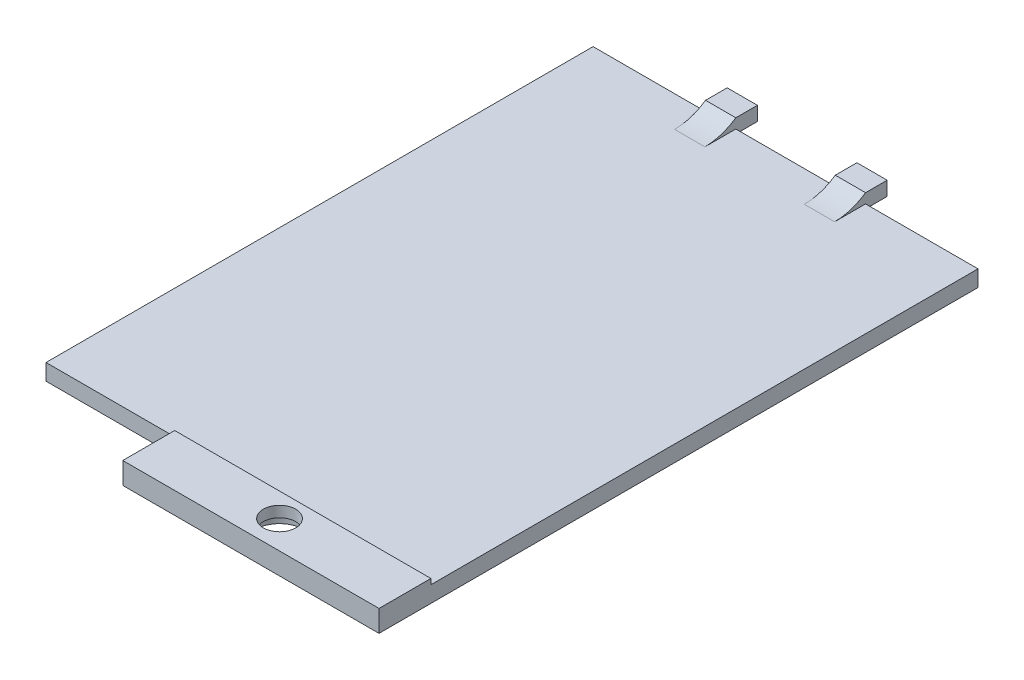
ISO-10303-21;
HEADER;
FILE_DESCRIPTION(('STEP AP214'),'2;1');
FILE_NAME('part.step','',(''),(''),'','','');
FILE_SCHEMA(('AUTOMOTIVE_DESIGN { 1 0 10303 214 1 1 1 1 }'));
ENDSEC;
DATA;
#1=APPLICATION_CONTEXT('core data for automotive mechanical design processes');
#2=APPLICATION_PROTOCOL_DEFINITION('international standard','automotive_design',2000,#1);
#3=PRODUCT_CONTEXT('',#1,'mechanical');
#4=PRODUCT('Part','Part','',(#3));
#5=PRODUCT_RELATED_PRODUCT_CATEGORY('part','',(#4));
#6=PRODUCT_DEFINITION_FORMATION('','',#4);
#7=PRODUCT_DEFINITION_CONTEXT('part definition',#1,'design');
#8=PRODUCT_DEFINITION('design','',#6,#7);
#9=PRODUCT_DEFINITION_SHAPE('','',#8);
#10=(LENGTH_UNIT() NAMED_UNIT(*) SI_UNIT(.MILLI.,.METRE.));
#11=(NAMED_UNIT(*) PLANE_ANGLE_UNIT() SI_UNIT($,.RADIAN.));
#12=(NAMED_UNIT(*) SI_UNIT($,.STERADIAN.) SOLID_ANGLE_UNIT());
#13=UNCERTAINTY_MEASURE_WITH_UNIT(LENGTH_MEASURE(1.E-05),#10,'distance_accuracy_value','');
#14=(GEOMETRIC_REPRESENTATION_CONTEXT(3) GLOBAL_UNCERTAINTY_ASSIGNED_CONTEXT((#13)) GLOBAL_UNIT_ASSIGNED_CONTEXT((#10,
#11,#12)) REPRESENTATION_CONTEXT('',''));
#15=CARTESIAN_POINT('',(0.,0.,0.));
#16=DIRECTION('',(0.,0.,1.));
#17=DIRECTION('',(1.,0.,0.));
#18=AXIS2_PLACEMENT_3D('',#15,#16,#17);
#19=CARTESIAN_POINT('',(0.,1.5,0.));
#20=DIRECTION('',(0.,0.,1.));
#21=DIRECTION('',(1.,0.,0.));
#22=AXIS2_PLACEMENT_3D('',#19,#20,#21);
#23=PLANE('',#22);
#24=DIRECTION('',(0.,1.,0.));
#25=VECTOR('',#24,1.);
#26=CARTESIAN_POINT('',(10.4,1.1,0.));
#27=LINE('',#26,#25);
#28=CARTESIAN_POINT('',(10.4,1.1,0.));
#29=VERTEX_POINT('',#28);
#30=CARTESIAN_POINT('',(10.4,1.5,0.));
#31=VERTEX_POINT('',#30);
#32=EDGE_CURVE('E207',#29,#31,#27,.T.);
#33=ORIENTED_EDGE('',*,*,#32,.F.);
#34=DIRECTION('',(-1.,0.,0.));
#35=VECTOR('',#34,1.);
#36=CARTESIAN_POINT('',(13.2,1.1,0.));
#37=LINE('',#36,#35);
#38=CARTESIAN_POINT('',(13.2,1.1,0.));
#39=VERTEX_POINT('',#38);
#40=EDGE_CURVE('E189',#39,#29,#37,.T.);
#41=ORIENTED_EDGE('',*,*,#40,.F.);
#42=DIRECTION('',(0.,1.,0.));
#43=VECTOR('',#42,1.);
#44=CARTESIAN_POINT('',(13.2,1.1,0.));
#45=LINE('',#44,#43);
#46=CARTESIAN_POINT('',(13.2,1.5,0.));
#47=VERTEX_POINT('',#46);
#48=EDGE_CURVE('E199',#39,#47,#45,.T.);
#49=ORIENTED_EDGE('',*,*,#48,.T.);
#50=DIRECTION('',(-1.,0.,0.));
#51=VECTOR('',#50,1.);
#52=CARTESIAN_POINT('',(0.,1.5,0.));
#53=LINE('',#52,#51);
#54=CARTESIAN_POINT('',(22.4,1.5,0.));
#55=VERTEX_POINT('',#54);
#56=EDGE_CURVE('E300',#55,#47,#53,.T.);
#57=ORIENTED_EDGE('',*,*,#56,.F.);
#58=DIRECTION('',(0.,1.,0.));
#59=VECTOR('',#58,1.);
#60=CARTESIAN_POINT('',(22.4,1.1,0.));
#61=LINE('',#60,#59);
#62=CARTESIAN_POINT('',(22.4,1.1,0.));
#63=VERTEX_POINT('',#62);
#64=EDGE_CURVE('E211',#63,#55,#61,.T.);
#65=ORIENTED_EDGE('',*,*,#64,.F.);
#66=DIRECTION('',(-1.,0.,0.));
#67=VECTOR('',#66,1.);
#68=CARTESIAN_POINT('',(25.2,1.1,0.));
#69=LINE('',#68,#67);
#70=CARTESIAN_POINT('',(25.2,1.1,0.));
#71=VERTEX_POINT('',#70);
#72=EDGE_CURVE('E208',#71,#63,#69,.T.);
#73=ORIENTED_EDGE('',*,*,#72,.F.);
#74=DIRECTION('',(0.,1.,0.));
#75=VECTOR('',#74,1.);
#76=CARTESIAN_POINT('',(25.2,1.1,0.));
#77=LINE('',#76,#75);
#78=CARTESIAN_POINT('',(25.2,1.5,0.));
#79=VERTEX_POINT('',#78);
#80=EDGE_CURVE('E227',#71,#79,#77,.T.);
#81=ORIENTED_EDGE('',*,*,#80,.T.);
#82=CARTESIAN_POINT('',(35.6,1.5,0.));
#83=VERTEX_POINT('',#82);
#84=EDGE_CURVE('E297',#83,#79,#53,.T.);
#85=ORIENTED_EDGE('',*,*,#84,.F.);
#86=DIRECTION('',(0.,-1.,0.));
#87=VECTOR('',#86,1.);
#88=CARTESIAN_POINT('',(35.6,1.5,0.));
#89=LINE('',#88,#87);
#90=CARTESIAN_POINT('',(35.6,0.,0.));
#91=VERTEX_POINT('',#90);
#92=EDGE_CURVE('E319',#83,#91,#89,.T.);
#93=ORIENTED_EDGE('',*,*,#92,.T.);
#94=DIRECTION('',(-1.,0.,0.));
#95=VECTOR('',#94,1.);
#96=CARTESIAN_POINT('',(0.,0.,0.));
#97=LINE('',#96,#95);
#98=CARTESIAN_POINT('',(0.,0.,0.));
#99=VERTEX_POINT('',#98);
#100=EDGE_CURVE('E309',#91,#99,#97,.T.);
#101=ORIENTED_EDGE('',*,*,#100,.T.);
#102=DIRECTION('',(0.,-1.,0.));
#103=VECTOR('',#102,1.);
#104=CARTESIAN_POINT('',(0.,1.5,0.));
#105=LINE('',#104,#103);
#106=CARTESIAN_POINT('',(0.,1.5,0.));
#107=VERTEX_POINT('',#106);
#108=EDGE_CURVE('E316',#107,#99,#105,.T.);
#109=ORIENTED_EDGE('',*,*,#108,.F.);
#110=EDGE_CURVE('E295',#31,#107,#53,.T.);
#111=ORIENTED_EDGE('',*,*,#110,.F.);
#112=EDGE_LOOP('',(#33,#41,#49,#57,#65,#73,#81,#85,#93,#101,#109,#111));
#113=FACE_BOUND('',#112,.T.);
#114=ADVANCED_FACE('F50',(#113),#23,.F.);
#115=CARTESIAN_POINT('',(23.8,2.,52.8));
#116=DIRECTION('',(0.,-1.,0.));
#117=DIRECTION('',(0.,0.,-1.));
#118=AXIS2_PLACEMENT_3D('',#115,#116,#117);
#119=CYLINDRICAL_SURFACE('',#118,1.5);
#120=CARTESIAN_POINT('',(23.8,2.,52.8));
#121=DIRECTION('',(0.,-1.,0.));
#122=DIRECTION('',(0.,0.,-1.));
#123=AXIS2_PLACEMENT_3D('',#120,#121,#122);
#124=CIRCLE('',#123,1.5);
#125=CARTESIAN_POINT('',(23.8,2.,51.3));
#126=VERTEX_POINT('',#125);
#127=EDGE_CURVE('E260',#126,#126,#124,.T.);
#128=ORIENTED_EDGE('',*,*,#127,.F.);
#129=EDGE_LOOP('',(#128));
#130=FACE_BOUND('',#129,.T.);
#131=CARTESIAN_POINT('',(23.8,1.,52.8));
#132=DIRECTION('',(0.,-1.,0.));
#133=DIRECTION('',(0.,0.,-1.));
#134=AXIS2_PLACEMENT_3D('',#131,#132,#133);
#135=CIRCLE('',#134,1.5);
#136=CARTESIAN_POINT('',(23.8,1.,51.3));
#137=VERTEX_POINT('',#136);
#138=EDGE_CURVE('E257',#137,#137,#135,.F.);
#139=ORIENTED_EDGE('',*,*,#138,.F.);
#140=EDGE_LOOP('',(#139));
#141=FACE_BOUND('',#140,.T.);
#142=ADVANCED_FACE('F407',(#130,#141),#119,.F.);
#143=CARTESIAN_POINT('',(0.,1.5,50.6));
#144=DIRECTION('',(0.,0.,-1.));
#145=DIRECTION('',(-1.,0.,0.));
#146=AXIS2_PLACEMENT_3D('',#143,#144,#145);
#147=PLANE('',#146);
#148=DIRECTION('',(0.,-1.,0.));
#149=VECTOR('',#148,1.);
#150=CARTESIAN_POINT('',(11.9,2.,50.6));
#151=LINE('',#150,#149);
#152=CARTESIAN_POINT('',(11.9,1.5,50.6));
#153=VERTEX_POINT('',#152);
#154=CARTESIAN_POINT('',(11.9,0.,50.6));
#155=VERTEX_POINT('',#154);
#156=EDGE_CURVE('E284',#153,#155,#151,.T.);
#157=ORIENTED_EDGE('',*,*,#156,.F.);
#158=DIRECTION('',(1.,0.,0.));
#159=VECTOR('',#158,1.);
#160=CARTESIAN_POINT('',(0.,1.5,50.6));
#161=LINE('',#160,#159);
#162=CARTESIAN_POINT('',(0.,1.5,50.6));
#163=VERTEX_POINT('',#162);
#164=EDGE_CURVE('E303',#163,#153,#161,.T.);
#165=ORIENTED_EDGE('',*,*,#164,.F.);
#166=DIRECTION('',(0.,-1.,0.));
#167=VECTOR('',#166,1.);
#168=CARTESIAN_POINT('',(0.,1.5,50.6));
#169=LINE('',#168,#167);
#170=CARTESIAN_POINT('',(0.,0.,50.6));
#171=VERTEX_POINT('',#170);
#172=EDGE_CURVE('E306',#163,#171,#169,.T.);
#173=ORIENTED_EDGE('',*,*,#172,.T.);
#174=DIRECTION('',(1.,0.,0.));
#175=VECTOR('',#174,1.);
#176=CARTESIAN_POINT('',(0.,0.,50.6));
#177=LINE('',#176,#175);
#178=EDGE_CURVE('E296',#171,#155,#177,.T.);
#179=ORIENTED_EDGE('',*,*,#178,.T.);
#180=EDGE_LOOP('',(#157,#165,#173,#179));
#181=FACE_BOUND('',#180,.T.);
#182=ADVANCED_FACE('F372',(#181),#147,.F.);
#183=CARTESIAN_POINT('',(35.6,1.5,50.6));
#184=DIRECTION('',(-1.,0.,0.));
#185=DIRECTION('',(0.,0.,1.));
#186=AXIS2_PLACEMENT_3D('',#183,#184,#185);
#187=PLANE('',#186);
#188=DIRECTION('',(0.,0.,-1.));
#189=VECTOR('',#188,1.);
#190=CARTESIAN_POINT('',(35.6,0.,50.6));
#191=LINE('',#190,#189);
#192=CARTESIAN_POINT('',(35.6,0.,55.4));
#193=VERTEX_POINT('',#192);
#194=EDGE_CURVE('E282',#193,#91,#191,.T.);
#195=ORIENTED_EDGE('',*,*,#194,.T.);
#196=ORIENTED_EDGE('',*,*,#92,.F.);
#197=DIRECTION('',(0.,0.,-1.));
#198=VECTOR('',#197,1.);
#199=CARTESIAN_POINT('',(35.6,1.5,50.6));
#200=LINE('',#199,#198);
#201=CARTESIAN_POINT('',(35.6,1.5,50.6));
#202=VERTEX_POINT('',#201);
#203=EDGE_CURVE('E292',#202,#83,#200,.T.);
#204=ORIENTED_EDGE('',*,*,#203,.F.);
#205=DIRECTION('',(0.,-1.,0.));
#206=VECTOR('',#205,1.);
#207=CARTESIAN_POINT('',(35.6,2.,50.6));
#208=LINE('',#207,#206);
#209=CARTESIAN_POINT('',(35.6,2.,50.6));
#210=VERTEX_POINT('',#209);
#211=EDGE_CURVE('E275',#210,#202,#208,.T.);
#212=ORIENTED_EDGE('',*,*,#211,.F.);
#213=DIRECTION('',(0.,0.,1.));
#214=VECTOR('',#213,1.);
#215=CARTESIAN_POINT('',(35.6,2.,50.6));
#216=LINE('',#215,#214);
#217=CARTESIAN_POINT('',(35.6,2.,55.4));
#218=VERTEX_POINT('',#217);
#219=EDGE_CURVE('E267',#210,#218,#216,.T.);
#220=ORIENTED_EDGE('',*,*,#219,.T.);
#221=DIRECTION('',(0.,-1.,0.));
#222=VECTOR('',#221,1.);
#223=CARTESIAN_POINT('',(35.6,2.,55.4));
#224=LINE('',#223,#222);
#225=EDGE_CURVE('E287',#218,#193,#224,.T.);
#226=ORIENTED_EDGE('',*,*,#225,.T.);
#227=EDGE_LOOP('',(#195,#196,#204,#212,#220,#226));
#228=FACE_BOUND('',#227,.T.);
#229=ADVANCED_FACE('F389',(#228),#187,.F.);
#230=CARTESIAN_POINT('',(0.,1.5,50.6));
#231=DIRECTION('',(1.,0.,0.));
#232=DIRECTION('',(0.,0.,-1.));
#233=AXIS2_PLACEMENT_3D('',#230,#231,#232);
#234=PLANE('',#233);
#235=DIRECTION('',(0.,0.,1.));
#236=VECTOR('',#235,1.);
#237=CARTESIAN_POINT('',(0.,0.,50.6));
#238=LINE('',#237,#236);
#239=EDGE_CURVE('E311',#99,#171,#238,.T.);
#240=ORIENTED_EDGE('',*,*,#239,.T.);
#241=ORIENTED_EDGE('',*,*,#172,.F.);
#242=DIRECTION('',(0.,0.,1.));
#243=VECTOR('',#242,1.);
#244=CARTESIAN_POINT('',(0.,1.5,50.6));
#245=LINE('',#244,#243);
#246=EDGE_CURVE('E299',#107,#163,#245,.T.);
#247=ORIENTED_EDGE('',*,*,#246,.F.);
#248=ORIENTED_EDGE('',*,*,#108,.T.);
#249=EDGE_LOOP('',(#240,#241,#247,#248));
#250=FACE_BOUND('',#249,.T.);
#251=ADVANCED_FACE('F368',(#250),#234,.F.);
#252=CARTESIAN_POINT('',(0.,1.5,0.));
#253=DIRECTION('',(0.,-1.,0.));
#254=DIRECTION('',(0.,0.,-1.));
#255=AXIS2_PLACEMENT_3D('',#252,#253,#254);
#256=PLANE('',#255);
#257=DIRECTION('',(1.,0.,0.));
#258=VECTOR('',#257,1.);
#259=CARTESIAN_POINT('',(0.,1.5,2.86181760425084));
#260=LINE('',#259,#258);
#261=CARTESIAN_POINT('',(13.2,1.5,2.86181760425084));
#262=VERTEX_POINT('',#261);
#263=CARTESIAN_POINT('',(10.4,1.5,2.86181760425084));
#264=VERTEX_POINT('',#263);
#265=EDGE_CURVE('E331',#262,#264,#260,.F.);
#266=ORIENTED_EDGE('',*,*,#265,.T.);
#267=DIRECTION('',(0.,0.,-1.));
#268=VECTOR('',#267,1.);
#269=CARTESIAN_POINT('',(10.4,1.5,-2.));
#270=LINE('',#269,#268);
#271=EDGE_CURVE('E334',#264,#31,#270,.T.);
#272=ORIENTED_EDGE('',*,*,#271,.T.);
#273=ORIENTED_EDGE('',*,*,#110,.T.);
#274=ORIENTED_EDGE('',*,*,#246,.T.);
#275=ORIENTED_EDGE('',*,*,#164,.T.);
#276=EDGE_CURVE('E302',#153,#202,#161,.T.);
#277=ORIENTED_EDGE('',*,*,#276,.T.);
#278=ORIENTED_EDGE('',*,*,#203,.T.);
#279=ORIENTED_EDGE('',*,*,#84,.T.);
#280=DIRECTION('',(0.,0.,1.));
#281=VECTOR('',#280,1.);
#282=CARTESIAN_POINT('',(25.2,1.5,0.));
#283=LINE('',#282,#281);
#284=CARTESIAN_POINT('',(25.2,1.5,2.86181760425084));
#285=VERTEX_POINT('',#284);
#286=EDGE_CURVE('E64',#79,#285,#283,.T.);
#287=ORIENTED_EDGE('',*,*,#286,.T.);
#288=DIRECTION('',(1.,0.,0.));
#289=VECTOR('',#288,1.);
#290=CARTESIAN_POINT('',(0.,1.5,2.86181760425084));
#291=LINE('',#290,#289);
#292=CARTESIAN_POINT('',(22.4,1.5,2.86181760425084));
#293=VERTEX_POINT('',#292);
#294=EDGE_CURVE('E325',#285,#293,#291,.F.);
#295=ORIENTED_EDGE('',*,*,#294,.T.);
#296=DIRECTION('',(0.,0.,-1.));
#297=VECTOR('',#296,1.);
#298=CARTESIAN_POINT('',(22.4,1.5,-2.));
#299=LINE('',#298,#297);
#300=EDGE_CURVE('E328',#293,#55,#299,.T.);
#301=ORIENTED_EDGE('',*,*,#300,.T.);
#302=ORIENTED_EDGE('',*,*,#56,.T.);
#303=DIRECTION('',(0.,0.,1.));
#304=VECTOR('',#303,1.);
#305=CARTESIAN_POINT('',(13.2,1.5,0.));
#306=LINE('',#305,#304);
#307=EDGE_CURVE('E72',#47,#262,#306,.T.);
#308=ORIENTED_EDGE('',*,*,#307,.T.);
#309=EDGE_LOOP('',(#266,#272,#273,#274,#275,#277,#278,#279,#287,#295,#301,#302,#308));
#310=FACE_BOUND('',#309,.T.);
#311=ADVANCED_FACE('F352',(#310),#256,.F.);
#312=CARTESIAN_POINT('',(0.,0.,0.));
#313=DIRECTION('',(0.,-1.,0.));
#314=DIRECTION('',(0.,0.,-1.));
#315=AXIS2_PLACEMENT_3D('',#312,#313,#314);
#316=PLANE('',#315);
#317=CARTESIAN_POINT('',(23.8,0.,52.8));
#318=DIRECTION('',(0.,-1.,0.));
#319=DIRECTION('',(0.,0.,-1.));
#320=AXIS2_PLACEMENT_3D('',#317,#318,#319);
#321=CIRCLE('',#320,2.25);
#322=CARTESIAN_POINT('',(23.8,0.,50.55));
#323=VERTEX_POINT('',#322);
#324=EDGE_CURVE('E253',#323,#323,#321,.T.);
#325=ORIENTED_EDGE('',*,*,#324,.F.);
#326=EDGE_LOOP('',(#325));
#327=FACE_BOUND('',#326,.T.);
#328=ORIENTED_EDGE('',*,*,#194,.F.);
#329=DIRECTION('',(1.,0.,0.));
#330=VECTOR('',#329,1.);
#331=CARTESIAN_POINT('',(11.9,0.,55.4));
#332=LINE('',#331,#330);
#333=CARTESIAN_POINT('',(11.9,0.,55.4));
#334=VERTEX_POINT('',#333);
#335=EDGE_CURVE('E263',#334,#193,#332,.T.);
#336=ORIENTED_EDGE('',*,*,#335,.F.);
#337=DIRECTION('',(0.,0.,1.));
#338=VECTOR('',#337,1.);
#339=CARTESIAN_POINT('',(11.9,0.,50.6));
#340=LINE('',#339,#338);
#341=EDGE_CURVE('E268',#155,#334,#340,.T.);
#342=ORIENTED_EDGE('',*,*,#341,.F.);
#343=ORIENTED_EDGE('',*,*,#178,.F.);
#344=ORIENTED_EDGE('',*,*,#239,.F.);
#345=ORIENTED_EDGE('',*,*,#100,.F.);
#346=EDGE_LOOP('',(#328,#336,#342,#343,#344,#345));
#347=FACE_BOUND('',#346,.T.);
#348=ADVANCED_FACE('F392',(#327,#347),#316,.T.);
#349=CARTESIAN_POINT('',(11.9,2.,50.6));
#350=DIRECTION('',(0.,0.,-1.));
#351=DIRECTION('',(-1.,0.,0.));
#352=AXIS2_PLACEMENT_3D('',#349,#350,#351);
#353=PLANE('',#352);
#354=ORIENTED_EDGE('',*,*,#276,.F.);
#355=CARTESIAN_POINT('',(11.9,2.,50.6));
#356=VERTEX_POINT('',#355);
#357=EDGE_CURVE('E279',#356,#153,#151,.T.);
#358=ORIENTED_EDGE('',*,*,#357,.F.);
#359=DIRECTION('',(1.,0.,0.));
#360=VECTOR('',#359,1.);
#361=CARTESIAN_POINT('',(11.9,2.,50.6));
#362=LINE('',#361,#360);
#363=EDGE_CURVE('E264',#356,#210,#362,.T.);
#364=ORIENTED_EDGE('',*,*,#363,.T.);
#365=ORIENTED_EDGE('',*,*,#211,.T.);
#366=EDGE_LOOP('',(#354,#358,#364,#365));
#367=FACE_BOUND('',#366,.T.);
#368=ADVANCED_FACE('F376',(#367),#353,.T.);
#369=CARTESIAN_POINT('',(11.9,2.,50.6));
#370=DIRECTION('',(1.,0.,0.));
#371=DIRECTION('',(0.,0.,-1.));
#372=AXIS2_PLACEMENT_3D('',#369,#370,#371);
#373=PLANE('',#372);
#374=ORIENTED_EDGE('',*,*,#341,.T.);
#375=DIRECTION('',(0.,-1.,0.));
#376=VECTOR('',#375,1.);
#377=CARTESIAN_POINT('',(11.9,2.,55.4));
#378=LINE('',#377,#376);
#379=CARTESIAN_POINT('',(11.9,2.,55.4));
#380=VERTEX_POINT('',#379);
#381=EDGE_CURVE('E283',#380,#334,#378,.T.);
#382=ORIENTED_EDGE('',*,*,#381,.F.);
#383=DIRECTION('',(0.,0.,1.));
#384=VECTOR('',#383,1.);
#385=CARTESIAN_POINT('',(11.9,2.,50.6));
#386=LINE('',#385,#384);
#387=EDGE_CURVE('E273',#356,#380,#386,.T.);
#388=ORIENTED_EDGE('',*,*,#387,.F.);
#389=ORIENTED_EDGE('',*,*,#357,.T.);
#390=ORIENTED_EDGE('',*,*,#156,.T.);
#391=EDGE_LOOP('',(#374,#382,#388,#389,#390));
#392=FACE_BOUND('',#391,.T.);
#393=ADVANCED_FACE('F379',(#392),#373,.F.);
#394=CARTESIAN_POINT('',(11.9,2.,55.4));
#395=DIRECTION('',(0.,0.,-1.));
#396=DIRECTION('',(-1.,0.,0.));
#397=AXIS2_PLACEMENT_3D('',#394,#395,#396);
#398=PLANE('',#397);
#399=ORIENTED_EDGE('',*,*,#335,.T.);
#400=ORIENTED_EDGE('',*,*,#225,.F.);
#401=DIRECTION('',(1.,0.,0.));
#402=VECTOR('',#401,1.);
#403=CARTESIAN_POINT('',(11.9,2.,55.4));
#404=LINE('',#403,#402);
#405=EDGE_CURVE('E271',#380,#218,#404,.T.);
#406=ORIENTED_EDGE('',*,*,#405,.F.);
#407=ORIENTED_EDGE('',*,*,#381,.T.);
#408=EDGE_LOOP('',(#399,#400,#406,#407));
#409=FACE_BOUND('',#408,.T.);
#410=ADVANCED_FACE('F394',(#409),#398,.F.);
#411=CARTESIAN_POINT('',(0.,2.,0.));
#412=DIRECTION('',(0.,-1.,0.));
#413=DIRECTION('',(0.,0.,-1.));
#414=AXIS2_PLACEMENT_3D('',#411,#412,#413);
#415=PLANE('',#414);
#416=ORIENTED_EDGE('',*,*,#127,.T.);
#417=EDGE_LOOP('',(#416));
#418=FACE_BOUND('',#417,.T.);
#419=ORIENTED_EDGE('',*,*,#363,.F.);
#420=ORIENTED_EDGE('',*,*,#387,.T.);
#421=ORIENTED_EDGE('',*,*,#405,.T.);
#422=ORIENTED_EDGE('',*,*,#219,.F.);
#423=EDGE_LOOP('',(#419,#420,#421,#422));
#424=FACE_BOUND('',#423,.T.);
#425=ADVANCED_FACE('F386',(#418,#424),#415,.F.);
#426=CARTESIAN_POINT('',(23.8,1.,52.8));
#427=DIRECTION('',(0.,-1.,0.));
#428=DIRECTION('',(0.,0.,-1.));
#429=AXIS2_PLACEMENT_3D('',#426,#427,#428);
#430=PLANE('',#429);
#431=CARTESIAN_POINT('',(23.8,1.,52.8));
#432=DIRECTION('',(0.,-1.,0.));
#433=DIRECTION('',(0.,0.,-1.));
#434=AXIS2_PLACEMENT_3D('',#431,#432,#433);
#435=CIRCLE('',#434,2.25);
#436=CARTESIAN_POINT('',(23.8,1.,50.55));
#437=VERTEX_POINT('',#436);
#438=EDGE_CURVE('E254',#437,#437,#435,.T.);
#439=ORIENTED_EDGE('',*,*,#438,.T.);
#440=EDGE_LOOP('',(#439));
#441=FACE_BOUND('',#440,.T.);
#442=ORIENTED_EDGE('',*,*,#138,.T.);
#443=EDGE_LOOP('',(#442));
#444=FACE_BOUND('',#443,.T.);
#445=ADVANCED_FACE('F401',(#441,#444),#430,.T.);
#446=CARTESIAN_POINT('',(23.8,1.,52.8));
#447=DIRECTION('',(0.,-1.,0.));
#448=DIRECTION('',(0.,0.,-1.));
#449=AXIS2_PLACEMENT_3D('',#446,#447,#448);
#450=CYLINDRICAL_SURFACE('',#449,2.25);
#451=ORIENTED_EDGE('',*,*,#438,.F.);
#452=EDGE_LOOP('',(#451));
#453=FACE_BOUND('',#452,.T.);
#454=ORIENTED_EDGE('',*,*,#324,.T.);
#455=EDGE_LOOP('',(#454));
#456=FACE_BOUND('',#455,.T.);
#457=ADVANCED_FACE('F465',(#453,#456),#450,.F.);
#458=CARTESIAN_POINT('',(25.2,1.1,-2.));
#459=DIRECTION('',(0.,1.,0.));
#460=DIRECTION('',(0.,0.,1.));
#461=AXIS2_PLACEMENT_3D('',#458,#459,#460);
#462=PLANE('',#461);
#463=ORIENTED_EDGE('',*,*,#72,.T.);
#464=DIRECTION('',(0.,0.,1.));
#465=VECTOR('',#464,1.);
#466=CARTESIAN_POINT('',(22.4,1.1,-2.));
#467=LINE('',#466,#465);
#468=CARTESIAN_POINT('',(22.4,1.1,-2.));
#469=VERTEX_POINT('',#468);
#470=EDGE_CURVE('E250',#469,#63,#467,.T.);
#471=ORIENTED_EDGE('',*,*,#470,.F.);
#472=DIRECTION('',(-1.,0.,0.));
#473=VECTOR('',#472,1.);
#474=CARTESIAN_POINT('',(25.2,1.1,-2.));
#475=LINE('',#474,#473);
#476=CARTESIAN_POINT('',(25.2,1.1,-2.));
#477=VERTEX_POINT('',#476);
#478=EDGE_CURVE('E223',#477,#469,#475,.T.);
#479=ORIENTED_EDGE('',*,*,#478,.F.);
#480=DIRECTION('',(0.,0.,1.));
#481=VECTOR('',#480,1.);
#482=CARTESIAN_POINT('',(25.2,1.1,-2.));
#483=LINE('',#482,#481);
#484=EDGE_CURVE('E234',#477,#71,#483,.T.);
#485=ORIENTED_EDGE('',*,*,#484,.T.);
#486=EDGE_LOOP('',(#463,#471,#479,#485));
#487=FACE_BOUND('',#486,.T.);
#488=ADVANCED_FACE('F359',(#487),#462,.F.);
#489=CARTESIAN_POINT('',(22.4,1.1,-2.));
#490=DIRECTION('',(1.,0.,0.));
#491=DIRECTION('',(0.,0.,-1.));
#492=AXIS2_PLACEMENT_3D('',#489,#490,#491);
#493=PLANE('',#492);
#494=ORIENTED_EDGE('',*,*,#64,.T.);
#495=ORIENTED_EDGE('',*,*,#300,.F.);
#496=CARTESIAN_POINT('',(22.4,6.5,2.86181760425084));
#497=DIRECTION('',(1.,0.,0.));
#498=DIRECTION('',(0.,0.,-1.));
#499=AXIS2_PLACEMENT_3D('',#496,#497,#498);
#500=CIRCLE('',#499,5.);
#501=CARTESIAN_POINT('',(22.4,2.4,0.));
#502=VERTEX_POINT('',#501);
#503=EDGE_CURVE('E58',#293,#502,#500,.T.);
#504=ORIENTED_EDGE('',*,*,#503,.T.);
#505=DIRECTION('',(0.,0.,1.));
#506=VECTOR('',#505,1.);
#507=CARTESIAN_POINT('',(22.4,2.4,-2.));
#508=LINE('',#507,#506);
#509=CARTESIAN_POINT('',(22.4,2.4,-2.));
#510=VERTEX_POINT('',#509);
#511=EDGE_CURVE('E247',#510,#502,#508,.T.);
#512=ORIENTED_EDGE('',*,*,#511,.F.);
#513=DIRECTION('',(0.,1.,0.));
#514=VECTOR('',#513,1.);
#515=CARTESIAN_POINT('',(22.4,1.1,-2.));
#516=LINE('',#515,#514);
#517=EDGE_CURVE('E226',#469,#510,#516,.T.);
#518=ORIENTED_EDGE('',*,*,#517,.F.);
#519=ORIENTED_EDGE('',*,*,#470,.T.);
#520=EDGE_LOOP('',(#494,#495,#504,#512,#518,#519));
#521=FACE_BOUND('',#520,.T.);
#522=ADVANCED_FACE('F342',(#521),#493,.F.);
#523=CARTESIAN_POINT('',(25.2,2.4,-2.));
#524=DIRECTION('',(0.,1.,0.));
#525=DIRECTION('',(0.,0.,1.));
#526=AXIS2_PLACEMENT_3D('',#523,#524,#525);
#527=PLANE('',#526);
#528=DIRECTION('',(-1.,0.,0.));
#529=VECTOR('',#528,1.);
#530=CARTESIAN_POINT('',(25.2,2.4,0.));
#531=LINE('',#530,#529);
#532=CARTESIAN_POINT('',(25.2,2.4,0.));
#533=VERTEX_POINT('',#532);
#534=EDGE_CURVE('E238',#533,#502,#531,.T.);
#535=ORIENTED_EDGE('',*,*,#534,.F.);
#536=DIRECTION('',(0.,0.,1.));
#537=VECTOR('',#536,1.);
#538=CARTESIAN_POINT('',(25.2,2.4,-2.));
#539=LINE('',#538,#537);
#540=CARTESIAN_POINT('',(25.2,2.4,-2.));
#541=VERTEX_POINT('',#540);
#542=EDGE_CURVE('E245',#541,#533,#539,.T.);
#543=ORIENTED_EDGE('',*,*,#542,.F.);
#544=DIRECTION('',(-1.,0.,0.));
#545=VECTOR('',#544,1.);
#546=CARTESIAN_POINT('',(25.2,2.4,-2.));
#547=LINE('',#546,#545);
#548=EDGE_CURVE('E229',#541,#510,#547,.T.);
#549=ORIENTED_EDGE('',*,*,#548,.T.);
#550=ORIENTED_EDGE('',*,*,#511,.T.);
#551=EDGE_LOOP('',(#535,#543,#549,#550));
#552=FACE_BOUND('',#551,.T.);
#553=ADVANCED_FACE('F347',(#552),#527,.T.);
#554=CARTESIAN_POINT('',(25.2,1.1,-2.));
#555=DIRECTION('',(1.,0.,0.));
#556=DIRECTION('',(0.,0.,-1.));
#557=AXIS2_PLACEMENT_3D('',#554,#555,#556);
#558=PLANE('',#557);
#559=ORIENTED_EDGE('',*,*,#80,.F.);
#560=ORIENTED_EDGE('',*,*,#484,.F.);
#561=DIRECTION('',(0.,1.,0.));
#562=VECTOR('',#561,1.);
#563=CARTESIAN_POINT('',(25.2,1.1,-2.));
#564=LINE('',#563,#562);
#565=EDGE_CURVE('E232',#477,#541,#564,.T.);
#566=ORIENTED_EDGE('',*,*,#565,.T.);
#567=ORIENTED_EDGE('',*,*,#542,.T.);
#568=CARTESIAN_POINT('',(25.2,6.5,2.86181760425084));
#569=DIRECTION('',(1.,0.,0.));
#570=DIRECTION('',(0.,0.,-1.));
#571=AXIS2_PLACEMENT_3D('',#568,#569,#570);
#572=CIRCLE('',#571,5.);
#573=EDGE_CURVE('E12',#533,#285,#572,.F.);
#574=ORIENTED_EDGE('',*,*,#573,.T.);
#575=ORIENTED_EDGE('',*,*,#286,.F.);
#576=EDGE_LOOP('',(#559,#560,#566,#567,#574,#575));
#577=FACE_BOUND('',#576,.T.);
#578=ADVANCED_FACE('F350',(#577),#558,.T.);
#579=CARTESIAN_POINT('',(0.,0.,-2.));
#580=DIRECTION('',(0.,0.,-1.));
#581=DIRECTION('',(-1.,0.,0.));
#582=AXIS2_PLACEMENT_3D('',#579,#580,#581);
#583=PLANE('',#582);
#584=ORIENTED_EDGE('',*,*,#478,.T.);
#585=ORIENTED_EDGE('',*,*,#517,.T.);
#586=ORIENTED_EDGE('',*,*,#548,.F.);
#587=ORIENTED_EDGE('',*,*,#565,.F.);
#588=EDGE_LOOP('',(#584,#585,#586,#587));
#589=FACE_BOUND('',#588,.T.);
#590=ADVANCED_FACE('F361',(#589),#583,.T.);
#591=CARTESIAN_POINT('',(13.2,1.1,-2.));
#592=DIRECTION('',(0.,1.,0.));
#593=DIRECTION('',(-1.,0.,0.));
#594=AXIS2_PLACEMENT_3D('',#591,#592,#593);
#595=PLANE('',#594);
#596=ORIENTED_EDGE('',*,*,#40,.T.);
#597=DIRECTION('',(0.,0.,1.));
#598=VECTOR('',#597,1.);
#599=CARTESIAN_POINT('',(10.4,1.1,-2.));
#600=LINE('',#599,#598);
#601=CARTESIAN_POINT('',(10.4,1.1,-2.));
#602=VERTEX_POINT('',#601);
#603=EDGE_CURVE('E441',#602,#29,#600,.T.);
#604=ORIENTED_EDGE('',*,*,#603,.F.);
#605=DIRECTION('',(-1.,0.,0.));
#606=VECTOR('',#605,1.);
#607=CARTESIAN_POINT('',(13.2,1.1,-2.));
#608=LINE('',#607,#606);
#609=CARTESIAN_POINT('',(13.2,1.1,-2.));
#610=VERTEX_POINT('',#609);
#611=EDGE_CURVE('E192',#610,#602,#608,.T.);
#612=ORIENTED_EDGE('',*,*,#611,.F.);
#613=DIRECTION('',(0.,0.,1.));
#614=VECTOR('',#613,1.);
#615=CARTESIAN_POINT('',(13.2,1.1,-2.));
#616=LINE('',#615,#614);
#617=EDGE_CURVE('E185',#610,#39,#616,.T.);
#618=ORIENTED_EDGE('',*,*,#617,.T.);
#619=EDGE_LOOP('',(#596,#604,#612,#618));
#620=FACE_BOUND('',#619,.T.);
#621=ADVANCED_FACE('F186',(#620),#595,.F.);
#622=CARTESIAN_POINT('',(10.4,1.1,-2.));
#623=DIRECTION('',(1.,0.,0.));
#624=DIRECTION('',(0.,0.,-1.));
#625=AXIS2_PLACEMENT_3D('',#622,#623,#624);
#626=PLANE('',#625);
#627=ORIENTED_EDGE('',*,*,#32,.T.);
#628=ORIENTED_EDGE('',*,*,#271,.F.);
#629=CARTESIAN_POINT('',(10.4,6.5,2.86181760425084));
#630=DIRECTION('',(1.,0.,0.));
#631=DIRECTION('',(0.,0.,-1.));
#632=AXIS2_PLACEMENT_3D('',#629,#630,#631);
#633=CIRCLE('',#632,5.);
#634=CARTESIAN_POINT('',(10.4,2.4,0.));
#635=VERTEX_POINT('',#634);
#636=EDGE_CURVE('E336',#264,#635,#633,.T.);
#637=ORIENTED_EDGE('',*,*,#636,.T.);
#638=DIRECTION('',(0.,0.,1.));
#639=VECTOR('',#638,1.);
#640=CARTESIAN_POINT('',(10.4,2.4,-2.));
#641=LINE('',#640,#639);
#642=CARTESIAN_POINT('',(10.4,2.4,-2.));
#643=VERTEX_POINT('',#642);
#644=EDGE_CURVE('E434',#643,#635,#641,.T.);
#645=ORIENTED_EDGE('',*,*,#644,.F.);
#646=DIRECTION('',(0.,1.,0.));
#647=VECTOR('',#646,1.);
#648=CARTESIAN_POINT('',(10.4,1.1,-2.));
#649=LINE('',#648,#647);
#650=EDGE_CURVE('E220',#602,#643,#649,.T.);
#651=ORIENTED_EDGE('',*,*,#650,.F.);
#652=ORIENTED_EDGE('',*,*,#603,.T.);
#653=EDGE_LOOP('',(#627,#628,#637,#645,#651,#652));
#654=FACE_BOUND('',#653,.T.);
#655=ADVANCED_FACE('F443',(#654),#626,.F.);
#656=CARTESIAN_POINT('',(13.2,2.4,-2.));
#657=DIRECTION('',(0.,1.,0.));
#658=DIRECTION('',(0.,0.,1.));
#659=AXIS2_PLACEMENT_3D('',#656,#657,#658);
#660=PLANE('',#659);
#661=DIRECTION('',(-1.,0.,0.));
#662=VECTOR('',#661,1.);
#663=CARTESIAN_POINT('',(13.2,2.4,0.));
#664=LINE('',#663,#662);
#665=CARTESIAN_POINT('',(13.2,2.4,0.));
#666=VERTEX_POINT('',#665);
#667=EDGE_CURVE('E203',#666,#635,#664,.T.);
#668=ORIENTED_EDGE('',*,*,#667,.F.);
#669=DIRECTION('',(0.,0.,1.));
#670=VECTOR('',#669,1.);
#671=CARTESIAN_POINT('',(13.2,2.4,-2.));
#672=LINE('',#671,#670);
#673=CARTESIAN_POINT('',(13.2,2.4,-2.));
#674=VERTEX_POINT('',#673);
#675=EDGE_CURVE('E196',#674,#666,#672,.T.);
#676=ORIENTED_EDGE('',*,*,#675,.F.);
#677=DIRECTION('',(-1.,0.,0.));
#678=VECTOR('',#677,1.);
#679=CARTESIAN_POINT('',(13.2,2.4,-2.));
#680=LINE('',#679,#678);
#681=EDGE_CURVE('E217',#674,#643,#680,.T.);
#682=ORIENTED_EDGE('',*,*,#681,.T.);
#683=ORIENTED_EDGE('',*,*,#644,.T.);
#684=EDGE_LOOP('',(#668,#676,#682,#683));
#685=FACE_BOUND('',#684,.T.);
#686=ADVANCED_FACE('F437',(#685),#660,.T.);
#687=CARTESIAN_POINT('',(13.2,1.1,-2.));
#688=DIRECTION('',(1.,0.,0.));
#689=DIRECTION('',(0.,0.,-1.));
#690=AXIS2_PLACEMENT_3D('',#687,#688,#689);
#691=PLANE('',#690);
#692=ORIENTED_EDGE('',*,*,#48,.F.);
#693=ORIENTED_EDGE('',*,*,#617,.F.);
#694=DIRECTION('',(0.,1.,0.));
#695=VECTOR('',#694,1.);
#696=CARTESIAN_POINT('',(13.2,1.1,-2.));
#697=LINE('',#696,#695);
#698=EDGE_CURVE('E195',#610,#674,#697,.T.);
#699=ORIENTED_EDGE('',*,*,#698,.T.);
#700=ORIENTED_EDGE('',*,*,#675,.T.);
#701=CARTESIAN_POINT('',(13.2,6.5,2.86181760425084));
#702=DIRECTION('',(1.,0.,0.));
#703=DIRECTION('',(0.,0.,-1.));
#704=AXIS2_PLACEMENT_3D('',#701,#702,#703);
#705=CIRCLE('',#704,5.);
#706=EDGE_CURVE('E338',#666,#262,#705,.F.);
#707=ORIENTED_EDGE('',*,*,#706,.T.);
#708=ORIENTED_EDGE('',*,*,#307,.F.);
#709=EDGE_LOOP('',(#692,#693,#699,#700,#707,#708));
#710=FACE_BOUND('',#709,.T.);
#711=ADVANCED_FACE('F200',(#710),#691,.T.);
#712=CARTESIAN_POINT('',(0.,0.,-2.));
#713=DIRECTION('',(0.,0.,-1.));
#714=DIRECTION('',(-1.,0.,0.));
#715=AXIS2_PLACEMENT_3D('',#712,#713,#714);
#716=PLANE('',#715);
#717=ORIENTED_EDGE('',*,*,#611,.T.);
#718=ORIENTED_EDGE('',*,*,#650,.T.);
#719=ORIENTED_EDGE('',*,*,#681,.F.);
#720=ORIENTED_EDGE('',*,*,#698,.F.);
#721=EDGE_LOOP('',(#717,#718,#719,#720));
#722=FACE_BOUND('',#721,.T.);
#723=ADVANCED_FACE('F420',(#722),#716,.T.);
#724=CARTESIAN_POINT('',(0.,6.5,2.86181760425084));
#725=DIRECTION('',(1.,0.,0.));
#726=DIRECTION('',(0.,0.,-1.));
#727=AXIS2_PLACEMENT_3D('',#724,#725,#726);
#728=CYLINDRICAL_SURFACE('',#727,5.);
#729=ORIENTED_EDGE('',*,*,#706,.F.);
#730=ORIENTED_EDGE('',*,*,#667,.T.);
#731=ORIENTED_EDGE('',*,*,#636,.F.);
#732=ORIENTED_EDGE('',*,*,#265,.F.);
#733=EDGE_LOOP('',(#729,#730,#731,#732));
#734=FACE_BOUND('',#733,.T.);
#735=ADVANCED_FACE('F418',(#734),#728,.F.);
#736=CARTESIAN_POINT('',(0.,6.5,2.86181760425084));
#737=DIRECTION('',(1.,0.,0.));
#738=DIRECTION('',(0.,0.,-1.));
#739=AXIS2_PLACEMENT_3D('',#736,#737,#738);
#740=CYLINDRICAL_SURFACE('',#739,5.);
#741=ORIENTED_EDGE('',*,*,#573,.F.);
#742=ORIENTED_EDGE('',*,*,#534,.T.);
#743=ORIENTED_EDGE('',*,*,#503,.F.);
#744=ORIENTED_EDGE('',*,*,#294,.F.);
#745=EDGE_LOOP('',(#741,#742,#743,#744));
#746=FACE_BOUND('',#745,.T.);
#747=ADVANCED_FACE('F52',(#746),#740,.F.);
#748=CLOSED_SHELL('',(#114,#142,#182,#229,#251,#311,#348,#368,#393,#410,#425,#445,#457,#488,
#522,#553,#578,#590,#621,#655,#686,#711,#723,#735,#747));
#749=MANIFOLD_SOLID_BREP('B2',#748);
#750=ADVANCED_BREP_SHAPE_REPRESENTATION('',(#18,#749),#14);
#751=SHAPE_DEFINITION_REPRESENTATION(#9,#750);
ENDSEC;
END-ISO-10303-21;
